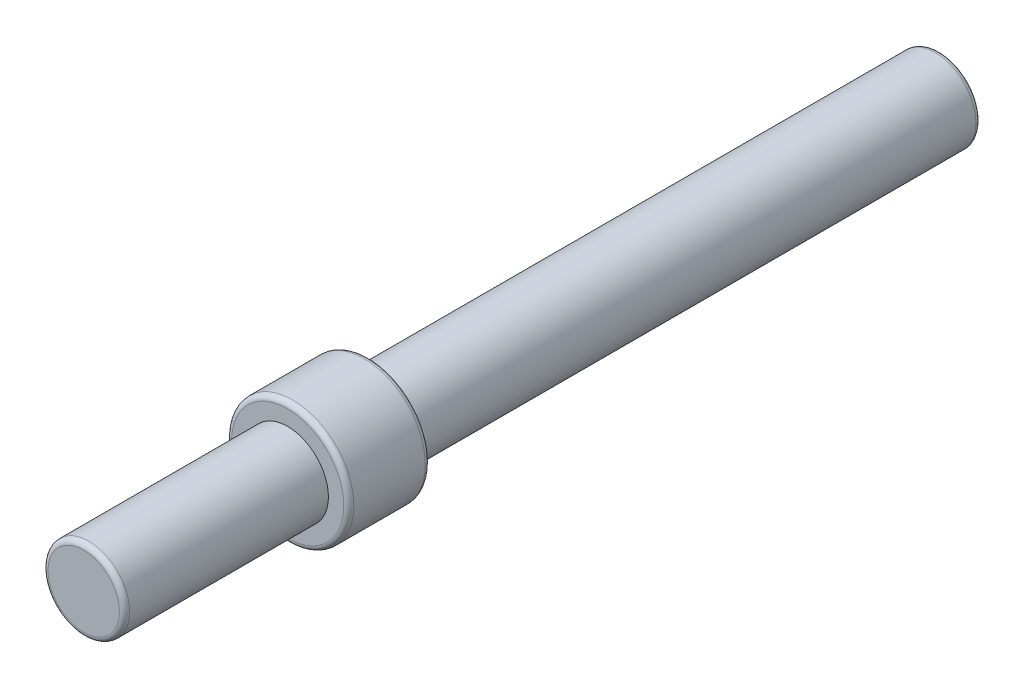
ISO-10303-21;
HEADER;
FILE_DESCRIPTION(('STEP AP214'),'2;1');
FILE_NAME('part.step','',(''),(''),'','','');
FILE_SCHEMA(('AUTOMOTIVE_DESIGN { 1 0 10303 214 1 1 1 1 }'));
ENDSEC;
DATA;
#1=APPLICATION_CONTEXT('core data for automotive mechanical design processes');
#2=APPLICATION_PROTOCOL_DEFINITION('international standard','automotive_design',2000,#1);
#3=PRODUCT_CONTEXT('',#1,'mechanical');
#4=PRODUCT('Part','Part','',(#3));
#5=PRODUCT_RELATED_PRODUCT_CATEGORY('part','',(#4));
#6=PRODUCT_DEFINITION_FORMATION('','',#4);
#7=PRODUCT_DEFINITION_CONTEXT('part definition',#1,'design');
#8=PRODUCT_DEFINITION('design','',#6,#7);
#9=PRODUCT_DEFINITION_SHAPE('','',#8);
#10=(LENGTH_UNIT() NAMED_UNIT(*) SI_UNIT(.MILLI.,.METRE.));
#11=(NAMED_UNIT(*) PLANE_ANGLE_UNIT() SI_UNIT($,.RADIAN.));
#12=(NAMED_UNIT(*) SI_UNIT($,.STERADIAN.) SOLID_ANGLE_UNIT());
#13=UNCERTAINTY_MEASURE_WITH_UNIT(LENGTH_MEASURE(1.E-05),#10,'distance_accuracy_value','');
#14=(GEOMETRIC_REPRESENTATION_CONTEXT(3) GLOBAL_UNCERTAINTY_ASSIGNED_CONTEXT((#13)) GLOBAL_UNIT_ASSIGNED_CONTEXT((#10,
#11,#12)) REPRESENTATION_CONTEXT('',''));
#15=CARTESIAN_POINT('',(0.,0.,0.));
#16=DIRECTION('',(0.,0.,1.));
#17=DIRECTION('',(1.,0.,0.));
#18=AXIS2_PLACEMENT_3D('',#15,#16,#17);
#19=CARTESIAN_POINT('',(0.,0.,-8.));
#20=DIRECTION('',(0.,0.,1.));
#21=DIRECTION('',(1.,0.,0.));
#22=AXIS2_PLACEMENT_3D('',#19,#20,#21);
#23=PLANE('',#22);
#24=CARTESIAN_POINT('',(0.,0.,-8.));
#25=DIRECTION('',(0.,0.,1.));
#26=DIRECTION('',(1.,0.,0.));
#27=AXIS2_PLACEMENT_3D('',#24,#25,#26);
#28=CIRCLE('',#27,5.5);
#29=CARTESIAN_POINT('',(5.5,0.,-8.));
#30=VERTEX_POINT('',#29);
#31=EDGE_CURVE('E39',#30,#30,#28,.F.);
#32=ORIENTED_EDGE('',*,*,#31,.T.);
#33=EDGE_LOOP('',(#32));
#34=FACE_BOUND('',#33,.T.);
#35=CARTESIAN_POINT('',(0.,0.,-8.));
#36=DIRECTION('',(0.,0.,1.));
#37=DIRECTION('',(1.,0.,0.));
#38=AXIS2_PLACEMENT_3D('',#35,#36,#37);
#39=CIRCLE('',#38,4.);
#40=CARTESIAN_POINT('',(4.,0.,-8.));
#41=VERTEX_POINT('',#40);
#42=EDGE_CURVE('E64',#41,#41,#39,.F.);
#43=ORIENTED_EDGE('',*,*,#42,.F.);
#44=EDGE_LOOP('',(#43));
#45=FACE_BOUND('',#44,.T.);
#46=ADVANCED_FACE('F32',(#34,#45),#23,.F.);
#47=CARTESIAN_POINT('',(0.,0.,20.));
#48=DIRECTION('',(0.,0.,-1.));
#49=DIRECTION('',(-1.,0.,0.));
#50=AXIS2_PLACEMENT_3D('',#47,#48,#49);
#51=CYLINDRICAL_SURFACE('',#50,4.);
#52=CARTESIAN_POINT('',(0.,0.,19.5));
#53=DIRECTION('',(0.,0.,1.));
#54=DIRECTION('',(1.,0.,0.));
#55=AXIS2_PLACEMENT_3D('',#52,#53,#54);
#56=CIRCLE('',#55,4.);
#57=CARTESIAN_POINT('',(4.,0.,19.5));
#58=VERTEX_POINT('',#57);
#59=EDGE_CURVE('E58',#58,#58,#56,.F.);
#60=ORIENTED_EDGE('',*,*,#59,.T.);
#61=EDGE_LOOP('',(#60));
#62=FACE_BOUND('',#61,.T.);
#63=CARTESIAN_POINT('',(0.,0.,0.));
#64=DIRECTION('',(0.,0.,1.));
#65=DIRECTION('',(1.,0.,0.));
#66=AXIS2_PLACEMENT_3D('',#63,#64,#65);
#67=CIRCLE('',#66,4.);
#68=CARTESIAN_POINT('',(4.,0.,0.));
#69=VERTEX_POINT('',#68);
#70=EDGE_CURVE('E67',#69,#69,#67,.T.);
#71=ORIENTED_EDGE('',*,*,#70,.T.);
#72=EDGE_LOOP('',(#71));
#73=FACE_BOUND('',#72,.T.);
#74=ADVANCED_FACE('F71',(#62,#73),#51,.T.);
#75=CARTESIAN_POINT('',(0.,0.,20.));
#76=DIRECTION('',(0.,0.,1.));
#77=DIRECTION('',(1.,0.,0.));
#78=AXIS2_PLACEMENT_3D('',#75,#76,#77);
#79=PLANE('',#78);
#80=CARTESIAN_POINT('',(0.,0.,20.));
#81=DIRECTION('',(0.,0.,1.));
#82=DIRECTION('',(1.,0.,0.));
#83=AXIS2_PLACEMENT_3D('',#80,#81,#82);
#84=CIRCLE('',#83,3.5);
#85=CARTESIAN_POINT('',(3.5,0.,20.));
#86=VERTEX_POINT('',#85);
#87=EDGE_CURVE('E61',#86,#86,#84,.T.);
#88=ORIENTED_EDGE('',*,*,#87,.T.);
#89=EDGE_LOOP('',(#88));
#90=FACE_BOUND('',#89,.T.);
#91=ADVANCED_FACE('F76',(#90),#79,.T.);
#92=CARTESIAN_POINT('',(0.,0.,0.));
#93=DIRECTION('',(0.,0.,1.));
#94=DIRECTION('',(1.,0.,0.));
#95=AXIS2_PLACEMENT_3D('',#92,#93,#94);
#96=PLANE('',#95);
#97=CARTESIAN_POINT('',(0.,0.,0.));
#98=DIRECTION('',(0.,0.,1.));
#99=DIRECTION('',(1.,0.,0.));
#100=AXIS2_PLACEMENT_3D('',#97,#98,#99);
#101=CIRCLE('',#100,5.5);
#102=CARTESIAN_POINT('',(5.5,0.,0.));
#103=VERTEX_POINT('',#102);
#104=EDGE_CURVE('E10',#103,#103,#101,.T.);
#105=ORIENTED_EDGE('',*,*,#104,.T.);
#106=EDGE_LOOP('',(#105));
#107=FACE_BOUND('',#106,.T.);
#108=ORIENTED_EDGE('',*,*,#70,.F.);
#109=EDGE_LOOP('',(#108));
#110=FACE_BOUND('',#109,.T.);
#111=ADVANCED_FACE('F73',(#107,#110),#96,.T.);
#112=CARTESIAN_POINT('',(0.,0.,-8.));
#113=DIRECTION('',(0.,0.,1.));
#114=DIRECTION('',(1.,0.,0.));
#115=AXIS2_PLACEMENT_3D('',#112,#113,#114);
#116=CYLINDRICAL_SURFACE('',#115,6.);
#117=CARTESIAN_POINT('',(0.,0.,-7.5));
#118=DIRECTION('',(0.,0.,1.));
#119=DIRECTION('',(1.,0.,0.));
#120=AXIS2_PLACEMENT_3D('',#117,#118,#119);
#121=CIRCLE('',#120,6.);
#122=CARTESIAN_POINT('',(6.,0.,-7.5));
#123=VERTEX_POINT('',#122);
#124=EDGE_CURVE('E43',#123,#123,#121,.T.);
#125=ORIENTED_EDGE('',*,*,#124,.T.);
#126=EDGE_LOOP('',(#125));
#127=FACE_BOUND('',#126,.T.);
#128=CARTESIAN_POINT('',(0.,0.,-0.5));
#129=DIRECTION('',(0.,0.,1.));
#130=DIRECTION('',(1.,0.,0.));
#131=AXIS2_PLACEMENT_3D('',#128,#129,#130);
#132=CIRCLE('',#131,6.);
#133=CARTESIAN_POINT('',(6.,0.,-0.5));
#134=VERTEX_POINT('',#133);
#135=EDGE_CURVE('E47',#134,#134,#132,.F.);
#136=ORIENTED_EDGE('',*,*,#135,.T.);
#137=EDGE_LOOP('',(#136));
#138=FACE_BOUND('',#137,.T.);
#139=ADVANCED_FACE('F75',(#127,#138),#116,.T.);
#140=CARTESIAN_POINT('',(0.,0.,-64.));
#141=DIRECTION('',(0.,0.,1.));
#142=DIRECTION('',(1.,0.,0.));
#143=AXIS2_PLACEMENT_3D('',#140,#141,#142);
#144=CYLINDRICAL_SURFACE('',#143,4.);
#145=CARTESIAN_POINT('',(0.,0.,-63.5));
#146=DIRECTION('',(0.,0.,-1.));
#147=DIRECTION('',(-1.,0.,0.));
#148=AXIS2_PLACEMENT_3D('',#145,#146,#147);
#149=CIRCLE('',#148,4.);
#150=CARTESIAN_POINT('',(-4.,0.,-63.5));
#151=VERTEX_POINT('',#150);
#152=EDGE_CURVE('E52',#151,#151,#149,.F.);
#153=ORIENTED_EDGE('',*,*,#152,.T.);
#154=EDGE_LOOP('',(#153));
#155=FACE_BOUND('',#154,.T.);
#156=ORIENTED_EDGE('',*,*,#42,.T.);
#157=EDGE_LOOP('',(#156));
#158=FACE_BOUND('',#157,.T.);
#159=ADVANCED_FACE('F82',(#155,#158),#144,.T.);
#160=CARTESIAN_POINT('',(0.,0.,-64.));
#161=DIRECTION('',(0.,0.,-1.));
#162=DIRECTION('',(-1.,0.,0.));
#163=AXIS2_PLACEMENT_3D('',#160,#161,#162);
#164=PLANE('',#163);
#165=CARTESIAN_POINT('',(0.,0.,-64.));
#166=DIRECTION('',(0.,0.,-1.));
#167=DIRECTION('',(-1.,0.,0.));
#168=AXIS2_PLACEMENT_3D('',#165,#166,#167);
#169=CIRCLE('',#168,3.5);
#170=CARTESIAN_POINT('',(-3.5,0.,-64.));
#171=VERTEX_POINT('',#170);
#172=EDGE_CURVE('E55',#171,#171,#169,.T.);
#173=ORIENTED_EDGE('',*,*,#172,.T.);
#174=EDGE_LOOP('',(#173));
#175=FACE_BOUND('',#174,.T.);
#176=ADVANCED_FACE('F98',(#175),#164,.T.);
#177=CARTESIAN_POINT('',(0.,0.,19.5));
#178=DIRECTION('',(0.,0.,1.));
#179=DIRECTION('',(1.,0.,0.));
#180=AXIS2_PLACEMENT_3D('',#177,#178,#179);
#181=TOROIDAL_SURFACE('',#180,3.5,0.5);
#182=ORIENTED_EDGE('',*,*,#59,.F.);
#183=EDGE_LOOP('',(#182));
#184=FACE_BOUND('',#183,.T.);
#185=ORIENTED_EDGE('',*,*,#87,.F.);
#186=EDGE_LOOP('',(#185));
#187=FACE_BOUND('',#186,.T.);
#188=ADVANCED_FACE('F101',(#184,#187),#181,.T.);
#189=CARTESIAN_POINT('',(0.,0.,-63.5));
#190=DIRECTION('',(0.,0.,-1.));
#191=DIRECTION('',(-1.,0.,0.));
#192=AXIS2_PLACEMENT_3D('',#189,#190,#191);
#193=TOROIDAL_SURFACE('',#192,3.5,0.5);
#194=ORIENTED_EDGE('',*,*,#152,.F.);
#195=EDGE_LOOP('',(#194));
#196=FACE_BOUND('',#195,.T.);
#197=ORIENTED_EDGE('',*,*,#172,.F.);
#198=EDGE_LOOP('',(#197));
#199=FACE_BOUND('',#198,.T.);
#200=ADVANCED_FACE('F106',(#196,#199),#193,.T.);
#201=CARTESIAN_POINT('',(0.,0.,-7.5));
#202=DIRECTION('',(0.,0.,1.));
#203=DIRECTION('',(1.,0.,0.));
#204=AXIS2_PLACEMENT_3D('',#201,#202,#203);
#205=TOROIDAL_SURFACE('',#204,5.5,0.5);
#206=ORIENTED_EDGE('',*,*,#31,.F.);
#207=EDGE_LOOP('',(#206));
#208=FACE_BOUND('',#207,.T.);
#209=ORIENTED_EDGE('',*,*,#124,.F.);
#210=EDGE_LOOP('',(#209));
#211=FACE_BOUND('',#210,.T.);
#212=ADVANCED_FACE('F112',(#208,#211),#205,.T.);
#213=CARTESIAN_POINT('',(0.,0.,-0.5));
#214=DIRECTION('',(0.,0.,1.));
#215=DIRECTION('',(1.,0.,0.));
#216=AXIS2_PLACEMENT_3D('',#213,#214,#215);
#217=TOROIDAL_SURFACE('',#216,5.5,0.5);
#218=ORIENTED_EDGE('',*,*,#135,.F.);
#219=EDGE_LOOP('',(#218));
#220=FACE_BOUND('',#219,.T.);
#221=ORIENTED_EDGE('',*,*,#104,.F.);
#222=EDGE_LOOP('',(#221));
#223=FACE_BOUND('',#222,.T.);
#224=ADVANCED_FACE('F34',(#220,#223),#217,.T.);
#225=CLOSED_SHELL('',(#46,#74,#91,#111,#139,#159,#176,#188,#200,#212,#224));
#226=MANIFOLD_SOLID_BREP('B2',#225);
#227=ADVANCED_BREP_SHAPE_REPRESENTATION('',(#18,#226),#14);
#228=SHAPE_DEFINITION_REPRESENTATION(#9,#227);
ENDSEC;
END-ISO-10303-21;
